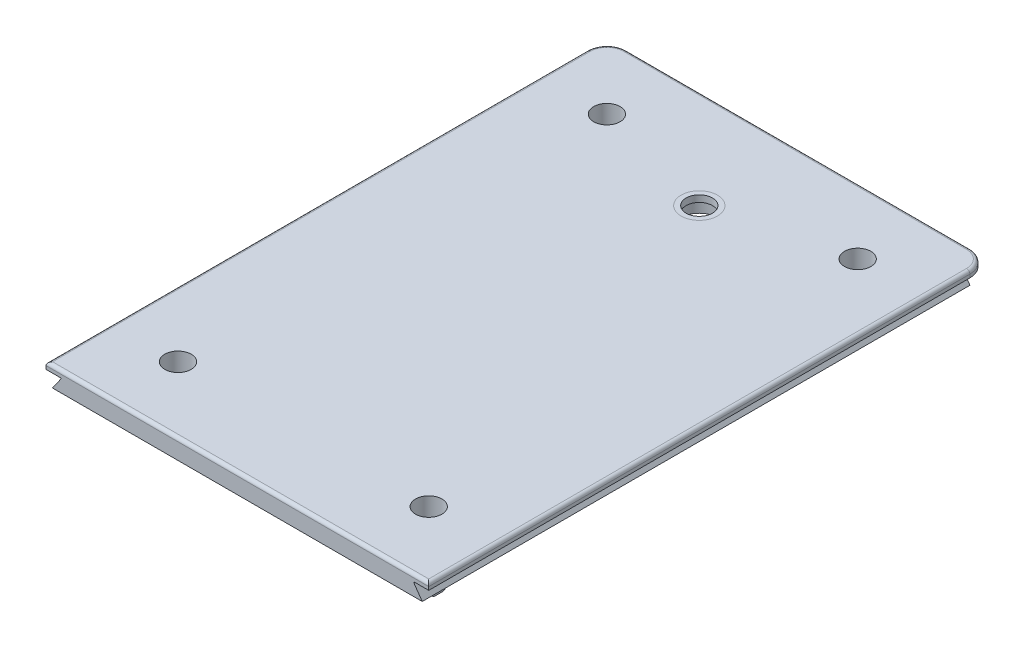
ISO-10303-21;
HEADER;
FILE_DESCRIPTION(('STEP AP214'),'2;1');
FILE_NAME('part.step','',(''),(''),'','','');
FILE_SCHEMA(('AUTOMOTIVE_DESIGN { 1 0 10303 214 1 1 1 1 }'));
ENDSEC;
DATA;
#1=APPLICATION_CONTEXT('core data for automotive mechanical design processes');
#2=APPLICATION_PROTOCOL_DEFINITION('international standard','automotive_design',2000,#1);
#3=PRODUCT_CONTEXT('',#1,'mechanical');
#4=PRODUCT('Part','Part','',(#3));
#5=PRODUCT_RELATED_PRODUCT_CATEGORY('part','',(#4));
#6=PRODUCT_DEFINITION_FORMATION('','',#4);
#7=PRODUCT_DEFINITION_CONTEXT('part definition',#1,'design');
#8=PRODUCT_DEFINITION('design','',#6,#7);
#9=PRODUCT_DEFINITION_SHAPE('','',#8);
#10=(LENGTH_UNIT() NAMED_UNIT(*) SI_UNIT(.MILLI.,.METRE.));
#11=(NAMED_UNIT(*) PLANE_ANGLE_UNIT() SI_UNIT($,.RADIAN.));
#12=(NAMED_UNIT(*) SI_UNIT($,.STERADIAN.) SOLID_ANGLE_UNIT());
#13=UNCERTAINTY_MEASURE_WITH_UNIT(LENGTH_MEASURE(1.E-05),#10,'distance_accuracy_value','');
#14=(GEOMETRIC_REPRESENTATION_CONTEXT(3) GLOBAL_UNCERTAINTY_ASSIGNED_CONTEXT((#13)) GLOBAL_UNIT_ASSIGNED_CONTEXT((#10,
#11,#12)) REPRESENTATION_CONTEXT('',''));
#15=CARTESIAN_POINT('',(0.,0.,0.));
#16=DIRECTION('',(0.,0.,1.));
#17=DIRECTION('',(1.,0.,0.));
#18=AXIS2_PLACEMENT_3D('',#15,#16,#17);
#19=CARTESIAN_POINT('',(0.,29.15,-70.));
#20=DIRECTION('',(0.,1.,0.));
#21=DIRECTION('',(0.,0.,1.));
#22=AXIS2_PLACEMENT_3D('',#19,#20,#21);
#23=CYLINDRICAL_SURFACE('',#22,2.75);
#24=CARTESIAN_POINT('',(0.,29.15,-70.));
#25=DIRECTION('',(0.,1.,0.));
#26=DIRECTION('',(0.,0.,1.));
#27=AXIS2_PLACEMENT_3D('',#24,#25,#26);
#28=CIRCLE('',#27,2.75);
#29=CARTESIAN_POINT('',(0.,29.15,-67.25));
#30=VERTEX_POINT('',#29);
#31=EDGE_CURVE('E11',#30,#30,#28,.T.);
#32=ORIENTED_EDGE('',*,*,#31,.T.);
#33=EDGE_LOOP('',(#32));
#34=FACE_BOUND('',#33,.T.);
#35=CARTESIAN_POINT('',(0.,30.15,-70.));
#36=DIRECTION('',(0.,1.,0.));
#37=DIRECTION('',(0.,0.,1.));
#38=AXIS2_PLACEMENT_3D('',#35,#36,#37);
#39=CIRCLE('',#38,2.75);
#40=CARTESIAN_POINT('',(0.,30.15,-67.25));
#41=VERTEX_POINT('',#40);
#42=EDGE_CURVE('E49',#41,#41,#39,.T.);
#43=ORIENTED_EDGE('',*,*,#42,.F.);
#44=EDGE_LOOP('',(#43));
#45=FACE_BOUND('',#44,.T.);
#46=ADVANCED_FACE('F46',(#34,#45),#23,.T.);
#47=CARTESIAN_POINT('',(0.,29.15,-70.));
#48=DIRECTION('',(0.,1.,0.));
#49=DIRECTION('',(0.,0.,1.));
#50=AXIS2_PLACEMENT_3D('',#47,#48,#49);
#51=PLANE('',#50);
#52=CARTESIAN_POINT('',(0.,29.15,-70.));
#53=DIRECTION('',(0.,1.,0.));
#54=DIRECTION('',(0.,0.,1.));
#55=AXIS2_PLACEMENT_3D('',#52,#53,#54);
#56=CIRCLE('',#55,2.);
#57=CARTESIAN_POINT('',(0.,29.15,-68.));
#58=VERTEX_POINT('',#57);
#59=EDGE_CURVE('E56',#58,#58,#56,.T.);
#60=ORIENTED_EDGE('',*,*,#59,.T.);
#61=EDGE_LOOP('',(#60));
#62=FACE_BOUND('',#61,.T.);
#63=ORIENTED_EDGE('',*,*,#31,.F.);
#64=EDGE_LOOP('',(#63));
#65=FACE_BOUND('',#64,.T.);
#66=ADVANCED_FACE('F64',(#62,#65),#51,.F.);
#67=CARTESIAN_POINT('',(0.,30.15,-70.));
#68=DIRECTION('',(0.,1.,0.));
#69=DIRECTION('',(0.,0.,1.));
#70=AXIS2_PLACEMENT_3D('',#67,#68,#69);
#71=PLANE('',#70);
#72=CARTESIAN_POINT('',(0.,30.15,-70.));
#73=DIRECTION('',(0.,1.,0.));
#74=DIRECTION('',(0.,0.,1.));
#75=AXIS2_PLACEMENT_3D('',#72,#73,#74);
#76=CIRCLE('',#75,2.);
#77=CARTESIAN_POINT('',(0.,30.15,-68.));
#78=VERTEX_POINT('',#77);
#79=EDGE_CURVE('E58',#78,#78,#76,.T.);
#80=ORIENTED_EDGE('',*,*,#79,.F.);
#81=EDGE_LOOP('',(#80));
#82=FACE_BOUND('',#81,.T.);
#83=ORIENTED_EDGE('',*,*,#42,.T.);
#84=EDGE_LOOP('',(#83));
#85=FACE_BOUND('',#84,.T.);
#86=ADVANCED_FACE('F70',(#82,#85),#71,.T.);
#87=CARTESIAN_POINT('',(0.,29.15,-70.));
#88=DIRECTION('',(0.,1.,0.));
#89=DIRECTION('',(0.,0.,1.));
#90=AXIS2_PLACEMENT_3D('',#87,#88,#89);
#91=CYLINDRICAL_SURFACE('',#90,2.);
#92=ORIENTED_EDGE('',*,*,#59,.F.);
#93=EDGE_LOOP('',(#92));
#94=FACE_BOUND('',#93,.T.);
#95=ORIENTED_EDGE('',*,*,#79,.T.);
#96=EDGE_LOOP('',(#95));
#97=FACE_BOUND('',#96,.T.);
#98=ADVANCED_FACE('F67',(#94,#97),#91,.F.);
#99=CLOSED_SHELL('',(#46,#66,#86,#98));
#100=MANIFOLD_SOLID_BREP('B2',#99);
#101=CARTESIAN_POINT('',(-28.0162186510252,27.2,-141.074973095129));
#102=DIRECTION('',(0.,-1.,0.));
#103=DIRECTION('',(1.,0.,0.));
#104=AXIS2_PLACEMENT_3D('',#101,#102,#103);
#105=PLANE('',#104);
#106=CARTESIAN_POINT('',(-19.,27.2,-10.));
#107=DIRECTION('',(0.,-1.,0.));
#108=DIRECTION('',(1.,0.,0.));
#109=AXIS2_PLACEMENT_3D('',#106,#107,#108);
#110=CIRCLE('',#109,2.);
#111=CARTESIAN_POINT('',(-17.,27.2,-10.));
#112=VERTEX_POINT('',#111);
#113=EDGE_CURVE('E424',#112,#112,#110,.F.);
#114=ORIENTED_EDGE('',*,*,#113,.T.);
#115=EDGE_LOOP('',(#114));
#116=FACE_BOUND('',#115,.T.);
#117=CARTESIAN_POINT('',(-19.,27.2,-75.));
#118=DIRECTION('',(0.,-1.,0.));
#119=DIRECTION('',(1.,0.,0.));
#120=AXIS2_PLACEMENT_3D('',#117,#118,#119);
#121=CIRCLE('',#120,2.);
#122=CARTESIAN_POINT('',(-17.,27.2,-75.));
#123=VERTEX_POINT('',#122);
#124=EDGE_CURVE('E593',#123,#123,#121,.F.);
#125=ORIENTED_EDGE('',*,*,#124,.T.);
#126=EDGE_LOOP('',(#125));
#127=FACE_BOUND('',#126,.T.);
#128=CARTESIAN_POINT('',(19.,27.2,-75.));
#129=DIRECTION('',(0.,-1.,0.));
#130=DIRECTION('',(1.,0.,0.));
#131=AXIS2_PLACEMENT_3D('',#128,#129,#130);
#132=CIRCLE('',#131,2.);
#133=CARTESIAN_POINT('',(21.,27.2,-75.));
#134=VERTEX_POINT('',#133);
#135=EDGE_CURVE('E440',#134,#134,#132,.F.);
#136=ORIENTED_EDGE('',*,*,#135,.T.);
#137=EDGE_LOOP('',(#136));
#138=FACE_BOUND('',#137,.T.);
#139=CARTESIAN_POINT('',(19.,27.2,-10.));
#140=DIRECTION('',(0.,-1.,0.));
#141=DIRECTION('',(1.,0.,0.));
#142=AXIS2_PLACEMENT_3D('',#139,#140,#141);
#143=CIRCLE('',#142,2.);
#144=CARTESIAN_POINT('',(21.,27.2,-10.));
#145=VERTEX_POINT('',#144);
#146=EDGE_CURVE('E437',#145,#145,#143,.F.);
#147=ORIENTED_EDGE('',*,*,#146,.T.);
#148=EDGE_LOOP('',(#147));
#149=FACE_BOUND('',#148,.T.);
#150=CARTESIAN_POINT('',(0.,27.2,-70.));
#151=DIRECTION('',(0.,-1.,0.));
#152=DIRECTION('',(1.,0.,0.));
#153=AXIS2_PLACEMENT_3D('',#150,#151,#152);
#154=CIRCLE('',#153,2.75);
#155=CARTESIAN_POINT('',(2.75,27.2,-70.));
#156=VERTEX_POINT('',#155);
#157=EDGE_CURVE('E436',#156,#156,#154,.F.);
#158=ORIENTED_EDGE('',*,*,#157,.T.);
#159=EDGE_LOOP('',(#158));
#160=FACE_BOUND('',#159,.T.);
#161=DIRECTION('',(1.,0.,0.));
#162=VECTOR('',#161,1.);
#163=CARTESIAN_POINT('',(28.0162186510252,27.2,-3.5));
#164=LINE('',#163,#162);
#165=CARTESIAN_POINT('',(-28.0162186510252,27.2,-3.5));
#166=VERTEX_POINT('',#165);
#167=CARTESIAN_POINT('',(28.0162186510252,27.2,-3.5));
#168=VERTEX_POINT('',#167);
#169=EDGE_CURVE('E282',#166,#168,#164,.T.);
#170=ORIENTED_EDGE('',*,*,#169,.F.);
#171=DIRECTION('',(0.,0.,1.));
#172=VECTOR('',#171,1.);
#173=CARTESIAN_POINT('',(-28.0162186510252,27.2,-141.074973095129));
#174=LINE('',#173,#172);
#175=CARTESIAN_POINT('',(-28.0162186510252,27.2,-83.));
#176=VERTEX_POINT('',#175);
#177=EDGE_CURVE('E281',#176,#166,#174,.T.);
#178=ORIENTED_EDGE('',*,*,#177,.F.);
#179=DIRECTION('',(-1.,0.,0.));
#180=VECTOR('',#179,1.);
#181=CARTESIAN_POINT('',(-28.0162186510252,27.2,-83.));
#182=LINE('',#181,#180);
#183=CARTESIAN_POINT('',(28.0162186510252,27.2,-83.));
#184=VERTEX_POINT('',#183);
#185=EDGE_CURVE('E315',#184,#176,#182,.T.);
#186=ORIENTED_EDGE('',*,*,#185,.F.);
#187=DIRECTION('',(0.,0.,1.));
#188=VECTOR('',#187,1.);
#189=CARTESIAN_POINT('',(28.0162186510252,27.2,-141.074973095129));
#190=LINE('',#189,#188);
#191=EDGE_CURVE('E355',#184,#168,#190,.T.);
#192=ORIENTED_EDGE('',*,*,#191,.T.);
#193=EDGE_LOOP('',(#170,#178,#186,#192));
#194=FACE_BOUND('',#193,.T.);
#195=ADVANCED_FACE('F124',(#116,#127,#138,#149,#160,#194),#105,.T.);
#196=CARTESIAN_POINT('',(-27.,27.,-83.));
#197=DIRECTION('',(0.,0.,1.));
#198=DIRECTION('',(-1.,0.,0.));
#199=AXIS2_PLACEMENT_3D('',#196,#197,#198);
#200=PLANE('',#199);
#201=DIRECTION('',(-1.,0.,0.));
#202=VECTOR('',#201,1.);
#203=CARTESIAN_POINT('',(29.,29.15,-83.));
#204=LINE('',#203,#202);
#205=CARTESIAN_POINT('',(26.7558450822477,29.15,-83.));
#206=VERTEX_POINT('',#205);
#207=CARTESIAN_POINT('',(-26.7558450822477,29.15,-83.));
#208=VERTEX_POINT('',#207);
#209=EDGE_CURVE('E310',#206,#208,#204,.T.);
#210=ORIENTED_EDGE('',*,*,#209,.F.);
#211=DIRECTION('',(0.,-1.,0.));
#212=VECTOR('',#211,1.);
#213=CARTESIAN_POINT('',(26.7558450822477,29.,-83.));
#214=LINE('',#213,#212);
#215=CARTESIAN_POINT('',(26.7558450822477,29.,-83.));
#216=VERTEX_POINT('',#215);
#217=EDGE_CURVE('E320',#206,#216,#214,.T.);
#218=ORIENTED_EDGE('',*,*,#217,.T.);
#219=DIRECTION('',(0.573576436351053,-0.819152044288987,0.));
#220=VECTOR('',#219,1.);
#221=CARTESIAN_POINT('',(28.0162186510252,27.2,-83.));
#222=LINE('',#221,#220);
#223=EDGE_CURVE('E317',#216,#184,#222,.T.);
#224=ORIENTED_EDGE('',*,*,#223,.T.);
#225=ORIENTED_EDGE('',*,*,#185,.T.);
#226=DIRECTION('',(0.573576436351054,0.819152044288987,0.));
#227=VECTOR('',#226,1.);
#228=CARTESIAN_POINT('',(-26.7558450822477,29.,-83.));
#229=LINE('',#228,#227);
#230=CARTESIAN_POINT('',(-26.7558450822477,29.,-83.));
#231=VERTEX_POINT('',#230);
#232=EDGE_CURVE('E314',#176,#231,#229,.T.);
#233=ORIENTED_EDGE('',*,*,#232,.T.);
#234=DIRECTION('',(0.,1.,0.));
#235=VECTOR('',#234,1.);
#236=CARTESIAN_POINT('',(-26.7558450822477,29.,-83.));
#237=LINE('',#236,#235);
#238=EDGE_CURVE('E322',#231,#208,#237,.T.);
#239=ORIENTED_EDGE('',*,*,#238,.T.);
#240=EDGE_LOOP('',(#210,#218,#224,#225,#233,#239));
#241=FACE_BOUND('',#240,.T.);
#242=ADVANCED_FACE('F463',(#241),#200,.F.);
#243=CARTESIAN_POINT('',(-26.7558450822477,29.,-141.074973095129));
#244=DIRECTION('',(-1.,0.,0.));
#245=DIRECTION('',(0.,0.,1.));
#246=AXIS2_PLACEMENT_3D('',#243,#244,#245);
#247=PLANE('',#246);
#248=ORIENTED_EDGE('',*,*,#238,.F.);
#249=DIRECTION('',(0.,0.,1.));
#250=VECTOR('',#249,1.);
#251=CARTESIAN_POINT('',(-26.7558450822477,29.,-141.074973095129));
#252=LINE('',#251,#250);
#253=CARTESIAN_POINT('',(-26.7558450822477,29.,0.));
#254=VERTEX_POINT('',#253);
#255=EDGE_CURVE('E291',#231,#254,#252,.T.);
#256=ORIENTED_EDGE('',*,*,#255,.T.);
#257=DIRECTION('',(0.,-1.,0.));
#258=VECTOR('',#257,1.);
#259=CARTESIAN_POINT('',(-26.7558450822477,29.,0.));
#260=LINE('',#259,#258);
#261=CARTESIAN_POINT('',(-26.7558450822477,29.15,0.));
#262=VERTEX_POINT('',#261);
#263=EDGE_CURVE('E309',#262,#254,#260,.T.);
#264=ORIENTED_EDGE('',*,*,#263,.F.);
#265=DIRECTION('',(0.,0.,1.));
#266=VECTOR('',#265,1.);
#267=CARTESIAN_POINT('',(-26.7558450822477,29.15,-141.074973095129));
#268=LINE('',#267,#266);
#269=EDGE_CURVE('E318',#208,#262,#268,.T.);
#270=ORIENTED_EDGE('',*,*,#269,.F.);
#271=EDGE_LOOP('',(#248,#256,#264,#270));
#272=FACE_BOUND('',#271,.T.);
#273=ADVANCED_FACE('F477',(#272),#247,.T.);
#274=CARTESIAN_POINT('',(-26.7558450822477,29.15,-141.074973095129));
#275=DIRECTION('',(0.,-1.,0.));
#276=DIRECTION('',(0.,0.,-1.));
#277=AXIS2_PLACEMENT_3D('',#274,#275,#276);
#278=PLANE('',#277);
#279=DIRECTION('',(1.,0.,0.));
#280=VECTOR('',#279,1.);
#281=CARTESIAN_POINT('',(29.,29.15,-85.));
#282=LINE('',#281,#280);
#283=CARTESIAN_POINT('',(-26.,29.15,-85.));
#284=VERTEX_POINT('',#283);
#285=CARTESIAN_POINT('',(26.,29.15,-85.));
#286=VERTEX_POINT('',#285);
#287=EDGE_CURVE('E306',#284,#286,#282,.T.);
#288=ORIENTED_EDGE('',*,*,#287,.T.);
#289=CARTESIAN_POINT('',(26.,29.15,-82.));
#290=DIRECTION('',(0.,-1.,0.));
#291=DIRECTION('',(0.,0.,-1.));
#292=AXIS2_PLACEMENT_3D('',#289,#290,#291);
#293=CIRCLE('',#292,3.);
#294=CARTESIAN_POINT('',(29.,29.15,-82.));
#295=VERTEX_POINT('',#294);
#296=EDGE_CURVE('E369',#286,#295,#293,.T.);
#297=ORIENTED_EDGE('',*,*,#296,.T.);
#298=DIRECTION('',(0.,0.,1.));
#299=VECTOR('',#298,1.);
#300=CARTESIAN_POINT('',(29.,29.15,-141.074973095129));
#301=LINE('',#300,#299);
#302=CARTESIAN_POINT('',(29.,29.15,0.));
#303=VERTEX_POINT('',#302);
#304=EDGE_CURVE('E349',#295,#303,#301,.T.);
#305=ORIENTED_EDGE('',*,*,#304,.T.);
#306=DIRECTION('',(1.,0.,0.));
#307=VECTOR('',#306,1.);
#308=CARTESIAN_POINT('',(26.7558450822477,29.15,0.));
#309=LINE('',#308,#307);
#310=CARTESIAN_POINT('',(26.7558450822477,29.15,0.));
#311=VERTEX_POINT('',#310);
#312=EDGE_CURVE('E335',#311,#303,#309,.T.);
#313=ORIENTED_EDGE('',*,*,#312,.F.);
#314=DIRECTION('',(0.,0.,1.));
#315=VECTOR('',#314,1.);
#316=CARTESIAN_POINT('',(26.7558450822477,29.15,-141.074973095129));
#317=LINE('',#316,#315);
#318=EDGE_CURVE('E351',#206,#311,#317,.T.);
#319=ORIENTED_EDGE('',*,*,#318,.F.);
#320=ORIENTED_EDGE('',*,*,#209,.T.);
#321=ORIENTED_EDGE('',*,*,#269,.T.);
#322=DIRECTION('',(1.,0.,0.));
#323=VECTOR('',#322,1.);
#324=CARTESIAN_POINT('',(-26.7558450822477,29.15,0.));
#325=LINE('',#324,#323);
#326=CARTESIAN_POINT('',(-29.,29.15,0.));
#327=VERTEX_POINT('',#326);
#328=EDGE_CURVE('E342',#327,#262,#325,.T.);
#329=ORIENTED_EDGE('',*,*,#328,.F.);
#330=DIRECTION('',(0.,0.,1.));
#331=VECTOR('',#330,1.);
#332=CARTESIAN_POINT('',(-29.,29.15,-141.074973095129));
#333=LINE('',#332,#331);
#334=CARTESIAN_POINT('',(-29.,29.15,-82.));
#335=VERTEX_POINT('',#334);
#336=EDGE_CURVE('E346',#335,#327,#333,.T.);
#337=ORIENTED_EDGE('',*,*,#336,.F.);
#338=CARTESIAN_POINT('',(-26.,29.15,-82.));
#339=DIRECTION('',(0.,-1.,0.));
#340=DIRECTION('',(0.,0.,-1.));
#341=AXIS2_PLACEMENT_3D('',#338,#339,#340);
#342=CIRCLE('',#341,3.);
#343=EDGE_CURVE('E367',#335,#284,#342,.T.);
#344=ORIENTED_EDGE('',*,*,#343,.T.);
#345=EDGE_LOOP('',(#288,#297,#305,#313,#319,#320,#321,#329,#337,#344));
#346=FACE_BOUND('',#345,.T.);
#347=ADVANCED_FACE('F480',(#346),#278,.T.);
#348=CARTESIAN_POINT('',(-29.,29.15,-141.074973095129));
#349=DIRECTION('',(-1.,0.,0.));
#350=DIRECTION('',(0.,0.,1.));
#351=AXIS2_PLACEMENT_3D('',#348,#349,#350);
#352=PLANE('',#351);
#353=DIRECTION('',(0.,-1.,0.));
#354=VECTOR('',#353,1.);
#355=CARTESIAN_POINT('',(-29.,29.15,0.));
#356=LINE('',#355,#354);
#357=CARTESIAN_POINT('',(-29.,29.65,0.));
#358=VERTEX_POINT('',#357);
#359=EDGE_CURVE('E340',#358,#327,#356,.T.);
#360=ORIENTED_EDGE('',*,*,#359,.F.);
#361=DIRECTION('',(0.,0.,1.));
#362=VECTOR('',#361,1.);
#363=CARTESIAN_POINT('',(-29.,29.65,-141.074973095129));
#364=LINE('',#363,#362);
#365=CARTESIAN_POINT('',(-29.,29.65,-82.));
#366=VERTEX_POINT('',#365);
#367=EDGE_CURVE('E394',#358,#366,#364,.F.);
#368=ORIENTED_EDGE('',*,*,#367,.T.);
#369=DIRECTION('',(0.,-1.,0.));
#370=VECTOR('',#369,1.);
#371=CARTESIAN_POINT('',(-29.,29.15,-82.));
#372=LINE('',#371,#370);
#373=EDGE_CURVE('E371',#366,#335,#372,.T.);
#374=ORIENTED_EDGE('',*,*,#373,.T.);
#375=ORIENTED_EDGE('',*,*,#336,.T.);
#376=EDGE_LOOP('',(#360,#368,#374,#375));
#377=FACE_BOUND('',#376,.T.);
#378=ADVANCED_FACE('F499',(#377),#352,.T.);
#379=CARTESIAN_POINT('',(-29.,30.15,-141.074973095129));
#380=DIRECTION('',(0.,1.,0.));
#381=DIRECTION('',(0.,0.,1.));
#382=AXIS2_PLACEMENT_3D('',#379,#380,#381);
#383=PLANE('',#382);
#384=CARTESIAN_POINT('',(-26.,30.15,-82.));
#385=DIRECTION('',(0.,1.,0.));
#386=DIRECTION('',(0.,0.,1.));
#387=AXIS2_PLACEMENT_3D('',#384,#385,#386);
#388=CIRCLE('',#387,2.5);
#389=CARTESIAN_POINT('',(-26.,30.15,-84.5));
#390=VERTEX_POINT('',#389);
#391=CARTESIAN_POINT('',(-28.5,30.15,-82.));
#392=VERTEX_POINT('',#391);
#393=EDGE_CURVE('E389',#390,#392,#388,.T.);
#394=ORIENTED_EDGE('',*,*,#393,.T.);
#395=DIRECTION('',(0.,0.,1.));
#396=VECTOR('',#395,1.);
#397=CARTESIAN_POINT('',(-28.5,30.15,-141.074973095129));
#398=LINE('',#397,#396);
#399=CARTESIAN_POINT('',(-28.5,30.15,-0.5));
#400=VERTEX_POINT('',#399);
#401=EDGE_CURVE('E391',#392,#400,#398,.T.);
#402=ORIENTED_EDGE('',*,*,#401,.T.);
#403=DIRECTION('',(-1.,0.,0.));
#404=VECTOR('',#403,1.);
#405=CARTESIAN_POINT('',(-29.,30.15,-0.5));
#406=LINE('',#405,#404);
#407=CARTESIAN_POINT('',(28.5,30.15,-0.5));
#408=VERTEX_POINT('',#407);
#409=EDGE_CURVE('E383',#400,#408,#406,.F.);
#410=ORIENTED_EDGE('',*,*,#409,.T.);
#411=DIRECTION('',(0.,0.,1.));
#412=VECTOR('',#411,1.);
#413=CARTESIAN_POINT('',(28.5,30.15,-141.074973095129));
#414=LINE('',#413,#412);
#415=CARTESIAN_POINT('',(28.5,30.15,-82.));
#416=VERTEX_POINT('',#415);
#417=EDGE_CURVE('E381',#408,#416,#414,.F.);
#418=ORIENTED_EDGE('',*,*,#417,.T.);
#419=CARTESIAN_POINT('',(26.,30.15,-82.));
#420=DIRECTION('',(0.,1.,0.));
#421=DIRECTION('',(0.,0.,1.));
#422=AXIS2_PLACEMENT_3D('',#419,#420,#421);
#423=CIRCLE('',#422,2.5);
#424=CARTESIAN_POINT('',(26.,30.15,-84.5));
#425=VERTEX_POINT('',#424);
#426=EDGE_CURVE('E385',#416,#425,#423,.T.);
#427=ORIENTED_EDGE('',*,*,#426,.T.);
#428=DIRECTION('',(-1.,0.,0.));
#429=VECTOR('',#428,1.);
#430=CARTESIAN_POINT('',(-26.,30.15,-84.5));
#431=LINE('',#430,#429);
#432=EDGE_CURVE('E387',#425,#390,#431,.T.);
#433=ORIENTED_EDGE('',*,*,#432,.T.);
#434=EDGE_LOOP('',(#394,#402,#410,#418,#427,#433));
#435=FACE_BOUND('',#434,.T.);
#436=CARTESIAN_POINT('',(-19.,30.15,-10.));
#437=DIRECTION('',(0.,1.,0.));
#438=DIRECTION('',(0.,0.,-1.));
#439=AXIS2_PLACEMENT_3D('',#436,#437,#438);
#440=CIRCLE('',#439,2.);
#441=CARTESIAN_POINT('',(-19.,30.15,-12.));
#442=VERTEX_POINT('',#441);
#443=EDGE_CURVE('E418',#442,#442,#440,.T.);
#444=ORIENTED_EDGE('',*,*,#443,.F.);
#445=EDGE_LOOP('',(#444));
#446=FACE_BOUND('',#445,.T.);
#447=CARTESIAN_POINT('',(-19.,30.15,-75.));
#448=DIRECTION('',(0.,1.,0.));
#449=DIRECTION('',(0.,0.,1.));
#450=AXIS2_PLACEMENT_3D('',#447,#448,#449);
#451=CIRCLE('',#450,2.);
#452=CARTESIAN_POINT('',(-19.,30.15,-73.));
#453=VERTEX_POINT('',#452);
#454=EDGE_CURVE('E429',#453,#453,#451,.T.);
#455=ORIENTED_EDGE('',*,*,#454,.F.);
#456=EDGE_LOOP('',(#455));
#457=FACE_BOUND('',#456,.T.);
#458=CARTESIAN_POINT('',(19.,30.15,-75.));
#459=DIRECTION('',(0.,1.,0.));
#460=DIRECTION('',(0.,0.,-1.));
#461=AXIS2_PLACEMENT_3D('',#458,#459,#460);
#462=CIRCLE('',#461,2.);
#463=CARTESIAN_POINT('',(19.,30.15,-77.));
#464=VERTEX_POINT('',#463);
#465=EDGE_CURVE('E591',#464,#464,#462,.T.);
#466=ORIENTED_EDGE('',*,*,#465,.F.);
#467=EDGE_LOOP('',(#466));
#468=FACE_BOUND('',#467,.T.);
#469=CARTESIAN_POINT('',(19.,30.15,-10.));
#470=DIRECTION('',(0.,1.,0.));
#471=DIRECTION('',(0.,0.,1.));
#472=AXIS2_PLACEMENT_3D('',#469,#470,#471);
#473=CIRCLE('',#472,2.);
#474=CARTESIAN_POINT('',(19.,30.15,-8.));
#475=VERTEX_POINT('',#474);
#476=EDGE_CURVE('E433',#475,#475,#473,.T.);
#477=ORIENTED_EDGE('',*,*,#476,.F.);
#478=EDGE_LOOP('',(#477));
#479=FACE_BOUND('',#478,.T.);
#480=CARTESIAN_POINT('',(0.,30.15,-70.));
#481=DIRECTION('',(0.,1.,0.));
#482=DIRECTION('',(0.,0.,1.));
#483=AXIS2_PLACEMENT_3D('',#480,#481,#482);
#484=CIRCLE('',#483,2.75);
#485=CARTESIAN_POINT('',(0.,30.15,-67.25));
#486=VERTEX_POINT('',#485);
#487=EDGE_CURVE('E299',#486,#486,#484,.T.);
#488=ORIENTED_EDGE('',*,*,#487,.F.);
#489=EDGE_LOOP('',(#488));
#490=FACE_BOUND('',#489,.T.);
#491=ADVANCED_FACE('F513',(#435,#446,#457,#468,#479,#490),#383,.T.);
#492=CARTESIAN_POINT('',(29.,29.15,-141.074973095129));
#493=DIRECTION('',(1.,0.,0.));
#494=DIRECTION('',(0.,0.,-1.));
#495=AXIS2_PLACEMENT_3D('',#492,#493,#494);
#496=PLANE('',#495);
#497=DIRECTION('',(0.,1.,0.));
#498=VECTOR('',#497,1.);
#499=CARTESIAN_POINT('',(29.,30.15,-82.));
#500=LINE('',#499,#498);
#501=CARTESIAN_POINT('',(29.,29.65,-82.));
#502=VERTEX_POINT('',#501);
#503=EDGE_CURVE('E313',#295,#502,#500,.T.);
#504=ORIENTED_EDGE('',*,*,#503,.T.);
#505=DIRECTION('',(0.,0.,1.));
#506=VECTOR('',#505,1.);
#507=CARTESIAN_POINT('',(29.,29.65,-141.074973095129));
#508=LINE('',#507,#506);
#509=CARTESIAN_POINT('',(29.,29.65,0.));
#510=VERTEX_POINT('',#509);
#511=EDGE_CURVE('E44',#502,#510,#508,.T.);
#512=ORIENTED_EDGE('',*,*,#511,.T.);
#513=DIRECTION('',(0.,1.,0.));
#514=VECTOR('',#513,1.);
#515=CARTESIAN_POINT('',(29.,29.15,0.));
#516=LINE('',#515,#514);
#517=EDGE_CURVE('E338',#303,#510,#516,.T.);
#518=ORIENTED_EDGE('',*,*,#517,.F.);
#519=ORIENTED_EDGE('',*,*,#304,.F.);
#520=EDGE_LOOP('',(#504,#512,#518,#519));
#521=FACE_BOUND('',#520,.T.);
#522=ADVANCED_FACE('F545',(#521),#496,.T.);
#523=CARTESIAN_POINT('',(26.7558450822477,29.,-141.074973095129));
#524=DIRECTION('',(1.,0.,0.));
#525=DIRECTION('',(0.,1.,0.));
#526=AXIS2_PLACEMENT_3D('',#523,#524,#525);
#527=PLANE('',#526);
#528=ORIENTED_EDGE('',*,*,#217,.F.);
#529=ORIENTED_EDGE('',*,*,#318,.T.);
#530=DIRECTION('',(0.,1.,0.));
#531=VECTOR('',#530,1.);
#532=CARTESIAN_POINT('',(26.7558450822477,29.,0.));
#533=LINE('',#532,#531);
#534=CARTESIAN_POINT('',(26.7558450822477,29.,0.));
#535=VERTEX_POINT('',#534);
#536=EDGE_CURVE('E332',#535,#311,#533,.T.);
#537=ORIENTED_EDGE('',*,*,#536,.F.);
#538=DIRECTION('',(0.,0.,1.));
#539=VECTOR('',#538,1.);
#540=CARTESIAN_POINT('',(26.7558450822477,29.,-141.074973095129));
#541=LINE('',#540,#539);
#542=EDGE_CURVE('E353',#216,#535,#541,.T.);
#543=ORIENTED_EDGE('',*,*,#542,.F.);
#544=EDGE_LOOP('',(#528,#529,#537,#543));
#545=FACE_BOUND('',#544,.T.);
#546=ADVANCED_FACE('F469',(#545),#527,.T.);
#547=CARTESIAN_POINT('',(28.0162186510252,27.2,-141.074973095129));
#548=DIRECTION('',(0.819152044288987,0.573576436351053,0.));
#549=DIRECTION('',(-0.573576436351053,0.819152044288987,0.));
#550=AXIS2_PLACEMENT_3D('',#547,#548,#549);
#551=PLANE('',#550);
#552=ORIENTED_EDGE('',*,*,#223,.F.);
#553=ORIENTED_EDGE('',*,*,#542,.T.);
#554=DIRECTION('',(-0.573576436351053,0.819152044288987,0.));
#555=VECTOR('',#554,1.);
#556=CARTESIAN_POINT('',(28.0162186510252,27.2,0.));
#557=LINE('',#556,#555);
#558=CARTESIAN_POINT('',(28.0162186510252,27.2,0.));
#559=VERTEX_POINT('',#558);
#560=EDGE_CURVE('E329',#559,#535,#557,.T.);
#561=ORIENTED_EDGE('',*,*,#560,.F.);
#562=CARTESIAN_POINT('',(28.0162186510252,27.2,-1.5));
#563=VERTEX_POINT('',#562);
#564=EDGE_CURVE('E357',#563,#559,#190,.T.);
#565=ORIENTED_EDGE('',*,*,#564,.F.);
#566=DIRECTION('',(0.,0.,1.));
#567=VECTOR('',#566,1.);
#568=CARTESIAN_POINT('',(28.0162186510252,27.2,-1.5));
#569=LINE('',#568,#567);
#570=EDGE_CURVE('E296',#168,#563,#569,.T.);
#571=ORIENTED_EDGE('',*,*,#570,.F.);
#572=ORIENTED_EDGE('',*,*,#191,.F.);
#573=EDGE_LOOP('',(#552,#553,#561,#565,#571,#572));
#574=FACE_BOUND('',#573,.T.);
#575=ADVANCED_FACE('F458',(#574),#551,.T.);
#576=DIRECTION('',(-1.,0.,0.));
#577=VECTOR('',#576,1.);
#578=CARTESIAN_POINT('',(28.0162186510252,27.2,-1.5));
#579=LINE('',#578,#577);
#580=CARTESIAN_POINT('',(-28.0162186510252,27.2,-1.50000000000001));
#581=VERTEX_POINT('',#580);
#582=EDGE_CURVE('E283',#563,#581,#579,.T.);
#583=ORIENTED_EDGE('',*,*,#582,.F.);
#584=ORIENTED_EDGE('',*,*,#564,.T.);
#585=DIRECTION('',(1.,0.,0.));
#586=VECTOR('',#585,1.);
#587=CARTESIAN_POINT('',(-28.0162186510252,27.2,0.));
#588=LINE('',#587,#586);
#589=CARTESIAN_POINT('',(-28.0162186510252,27.2,0.));
#590=VERTEX_POINT('',#589);
#591=EDGE_CURVE('E289',#590,#559,#588,.T.);
#592=ORIENTED_EDGE('',*,*,#591,.F.);
#593=EDGE_CURVE('E278',#581,#590,#174,.T.);
#594=ORIENTED_EDGE('',*,*,#593,.F.);
#595=EDGE_LOOP('',(#583,#584,#592,#594));
#596=FACE_BOUND('',#595,.T.);
#597=ADVANCED_FACE('F286',(#596),#105,.T.);
#598=CARTESIAN_POINT('',(-26.7558450822477,29.,-141.074973095129));
#599=DIRECTION('',(-0.819152044288987,0.573576436351054,0.));
#600=DIRECTION('',(-0.573576436351054,-0.819152044288987,0.));
#601=AXIS2_PLACEMENT_3D('',#598,#599,#600);
#602=PLANE('',#601);
#603=ORIENTED_EDGE('',*,*,#232,.F.);
#604=ORIENTED_EDGE('',*,*,#177,.T.);
#605=DIRECTION('',(0.,0.,-1.));
#606=VECTOR('',#605,1.);
#607=CARTESIAN_POINT('',(-28.0162186510252,27.2,-1.50000000000001));
#608=LINE('',#607,#606);
#609=EDGE_CURVE('E261',#581,#166,#608,.T.);
#610=ORIENTED_EDGE('',*,*,#609,.F.);
#611=ORIENTED_EDGE('',*,*,#593,.T.);
#612=DIRECTION('',(-0.573576436351054,-0.819152044288986,0.));
#613=VECTOR('',#612,1.);
#614=CARTESIAN_POINT('',(-26.7558450822477,29.,0.));
#615=LINE('',#614,#613);
#616=EDGE_CURVE('E326',#254,#590,#615,.T.);
#617=ORIENTED_EDGE('',*,*,#616,.F.);
#618=ORIENTED_EDGE('',*,*,#255,.F.);
#619=EDGE_LOOP('',(#603,#604,#610,#611,#617,#618));
#620=FACE_BOUND('',#619,.T.);
#621=ADVANCED_FACE('F276',(#620),#602,.T.);
#622=CARTESIAN_POINT('',(0.,0.,0.));
#623=DIRECTION('',(0.,0.,1.));
#624=DIRECTION('',(1.,0.,0.));
#625=AXIS2_PLACEMENT_3D('',#622,#623,#624);
#626=PLANE('',#625);
#627=ORIENTED_EDGE('',*,*,#517,.T.);
#628=DIRECTION('',(-1.,0.,0.));
#629=VECTOR('',#628,1.);
#630=CARTESIAN_POINT('',(0.,29.65,0.));
#631=LINE('',#630,#629);
#632=EDGE_CURVE('E133',#510,#358,#631,.T.);
#633=ORIENTED_EDGE('',*,*,#632,.T.);
#634=ORIENTED_EDGE('',*,*,#359,.T.);
#635=ORIENTED_EDGE('',*,*,#328,.T.);
#636=ORIENTED_EDGE('',*,*,#263,.T.);
#637=ORIENTED_EDGE('',*,*,#616,.T.);
#638=ORIENTED_EDGE('',*,*,#591,.T.);
#639=ORIENTED_EDGE('',*,*,#560,.T.);
#640=ORIENTED_EDGE('',*,*,#536,.T.);
#641=ORIENTED_EDGE('',*,*,#312,.T.);
#642=EDGE_LOOP('',(#627,#633,#634,#635,#636,#637,#638,#639,#640,#641));
#643=FACE_BOUND('',#642,.T.);
#644=ADVANCED_FACE('F473',(#643),#626,.T.);
#645=CARTESIAN_POINT('',(29.,2.,-85.));
#646=DIRECTION('',(0.,0.,1.));
#647=DIRECTION('',(-1.,0.,0.));
#648=AXIS2_PLACEMENT_3D('',#645,#646,#647);
#649=PLANE('',#648);
#650=DIRECTION('',(0.,-1.,0.));
#651=VECTOR('',#650,1.);
#652=CARTESIAN_POINT('',(-26.,30.15,-85.));
#653=LINE('',#652,#651);
#654=CARTESIAN_POINT('',(-26.,29.65,-85.));
#655=VERTEX_POINT('',#654);
#656=EDGE_CURVE('E362',#284,#655,#653,.F.);
#657=ORIENTED_EDGE('',*,*,#656,.T.);
#658=DIRECTION('',(-1.,0.,0.));
#659=VECTOR('',#658,1.);
#660=CARTESIAN_POINT('',(26.,29.65,-85.));
#661=LINE('',#660,#659);
#662=CARTESIAN_POINT('',(26.,29.65,-85.));
#663=VERTEX_POINT('',#662);
#664=EDGE_CURVE('E399',#655,#663,#661,.F.);
#665=ORIENTED_EDGE('',*,*,#664,.T.);
#666=DIRECTION('',(0.,1.,0.));
#667=VECTOR('',#666,1.);
#668=CARTESIAN_POINT('',(26.,29.15,-85.));
#669=LINE('',#668,#667);
#670=EDGE_CURVE('E365',#663,#286,#669,.F.);
#671=ORIENTED_EDGE('',*,*,#670,.T.);
#672=ORIENTED_EDGE('',*,*,#287,.F.);
#673=EDGE_LOOP('',(#657,#665,#671,#672));
#674=FACE_BOUND('',#673,.T.);
#675=ADVANCED_FACE('F508',(#674),#649,.F.);
#676=CARTESIAN_POINT('',(26.,29.15,-82.));
#677=DIRECTION('',(0.,-1.,0.));
#678=DIRECTION('',(0.,0.,-1.));
#679=AXIS2_PLACEMENT_3D('',#676,#677,#678);
#680=CYLINDRICAL_SURFACE('',#679,3.);
#681=ORIENTED_EDGE('',*,*,#670,.F.);
#682=CARTESIAN_POINT('',(26.,29.65,-82.));
#683=DIRECTION('',(0.,1.,0.));
#684=DIRECTION('',(0.,0.,1.));
#685=AXIS2_PLACEMENT_3D('',#682,#683,#684);
#686=CIRCLE('',#685,3.);
#687=EDGE_CURVE('E147',#663,#502,#686,.F.);
#688=ORIENTED_EDGE('',*,*,#687,.T.);
#689=ORIENTED_EDGE('',*,*,#503,.F.);
#690=ORIENTED_EDGE('',*,*,#296,.F.);
#691=EDGE_LOOP('',(#681,#688,#689,#690));
#692=FACE_BOUND('',#691,.T.);
#693=ADVANCED_FACE('F509',(#692),#680,.T.);
#694=CARTESIAN_POINT('',(-26.,29.15,-82.));
#695=DIRECTION('',(0.,1.,0.));
#696=DIRECTION('',(0.,0.,1.));
#697=AXIS2_PLACEMENT_3D('',#694,#695,#696);
#698=CYLINDRICAL_SURFACE('',#697,3.);
#699=ORIENTED_EDGE('',*,*,#373,.F.);
#700=CARTESIAN_POINT('',(-26.,29.65,-82.));
#701=DIRECTION('',(0.,1.,0.));
#702=DIRECTION('',(0.,0.,1.));
#703=AXIS2_PLACEMENT_3D('',#700,#701,#702);
#704=CIRCLE('',#703,3.);
#705=EDGE_CURVE('E397',#366,#655,#704,.F.);
#706=ORIENTED_EDGE('',*,*,#705,.T.);
#707=ORIENTED_EDGE('',*,*,#656,.F.);
#708=ORIENTED_EDGE('',*,*,#343,.F.);
#709=EDGE_LOOP('',(#699,#706,#707,#708));
#710=FACE_BOUND('',#709,.T.);
#711=ADVANCED_FACE('F502',(#710),#698,.T.);
#712=CARTESIAN_POINT('',(28.0162186510252,26.95,-1.5));
#713=DIRECTION('',(-1.,0.,0.));
#714=DIRECTION('',(0.,0.,1.));
#715=AXIS2_PLACEMENT_3D('',#712,#713,#714);
#716=PLANE('',#715);
#717=DIRECTION('',(0.,0.,1.));
#718=VECTOR('',#717,1.);
#719=CARTESIAN_POINT('',(28.0162186510252,26.95,-1.5));
#720=LINE('',#719,#718);
#721=CARTESIAN_POINT('',(28.0162186510252,26.95,-3.06698729810778));
#722=VERTEX_POINT('',#721);
#723=CARTESIAN_POINT('',(28.0162186510252,26.95,-1.93301270189222));
#724=VERTEX_POINT('',#723);
#725=EDGE_CURVE('E305',#722,#724,#720,.T.);
#726=ORIENTED_EDGE('',*,*,#725,.F.);
#727=CARTESIAN_POINT('',(28.0162186510252,27.45,-3.06698729810778));
#728=DIRECTION('',(-1.,0.,0.));
#729=DIRECTION('',(0.,0.,1.));
#730=AXIS2_PLACEMENT_3D('',#727,#728,#729);
#731=CIRCLE('',#730,0.5);
#732=EDGE_CURVE('E270',#722,#168,#731,.F.);
#733=ORIENTED_EDGE('',*,*,#732,.T.);
#734=ORIENTED_EDGE('',*,*,#570,.T.);
#735=CARTESIAN_POINT('',(28.0162186510252,27.45,-1.93301270189222));
#736=DIRECTION('',(-1.,0.,0.));
#737=DIRECTION('',(0.,0.,1.));
#738=AXIS2_PLACEMENT_3D('',#735,#736,#737);
#739=CIRCLE('',#738,0.5);
#740=EDGE_CURVE('E295',#563,#724,#739,.F.);
#741=ORIENTED_EDGE('',*,*,#740,.T.);
#742=EDGE_LOOP('',(#726,#733,#734,#741));
#743=FACE_BOUND('',#742,.T.);
#744=ADVANCED_FACE('F454',(#743),#716,.F.);
#745=CARTESIAN_POINT('',(-28.0162186510252,26.95,-1.50000000000001));
#746=DIRECTION('',(1.,0.,0.));
#747=DIRECTION('',(0.,0.,-1.));
#748=AXIS2_PLACEMENT_3D('',#745,#746,#747);
#749=PLANE('',#748);
#750=ORIENTED_EDGE('',*,*,#609,.T.);
#751=CARTESIAN_POINT('',(-28.0162186510252,27.45,-3.06698729810779));
#752=DIRECTION('',(1.,0.,0.));
#753=DIRECTION('',(0.,0.,-1.));
#754=AXIS2_PLACEMENT_3D('',#751,#752,#753);
#755=CIRCLE('',#754,0.5);
#756=CARTESIAN_POINT('',(-28.0162186510252,26.95,-3.06698729810779));
#757=VERTEX_POINT('',#756);
#758=EDGE_CURVE('E269',#166,#757,#755,.F.);
#759=ORIENTED_EDGE('',*,*,#758,.T.);
#760=DIRECTION('',(0.,0.,-1.));
#761=VECTOR('',#760,1.);
#762=CARTESIAN_POINT('',(-28.0162186510252,26.95,-1.50000000000001));
#763=LINE('',#762,#761);
#764=CARTESIAN_POINT('',(-28.0162186510252,26.95,-1.93301270189223));
#765=VERTEX_POINT('',#764);
#766=EDGE_CURVE('E264',#765,#757,#763,.T.);
#767=ORIENTED_EDGE('',*,*,#766,.F.);
#768=CARTESIAN_POINT('',(-28.0162186510252,27.45,-1.93301270189223));
#769=DIRECTION('',(1.,0.,0.));
#770=DIRECTION('',(0.,0.,-1.));
#771=AXIS2_PLACEMENT_3D('',#768,#769,#770);
#772=CIRCLE('',#771,0.5);
#773=EDGE_CURVE('E258',#765,#581,#772,.F.);
#774=ORIENTED_EDGE('',*,*,#773,.T.);
#775=EDGE_LOOP('',(#750,#759,#767,#774));
#776=FACE_BOUND('',#775,.T.);
#777=ADVANCED_FACE('F260',(#776),#749,.F.);
#778=CARTESIAN_POINT('',(0.,26.95,0.));
#779=DIRECTION('',(0.,1.,0.));
#780=DIRECTION('',(0.,0.,1.));
#781=AXIS2_PLACEMENT_3D('',#778,#779,#780);
#782=PLANE('',#781);
#783=ORIENTED_EDGE('',*,*,#766,.T.);
#784=DIRECTION('',(1.,0.,0.));
#785=VECTOR('',#784,1.);
#786=CARTESIAN_POINT('',(0.,26.95,-3.06698729810778));
#787=LINE('',#786,#785);
#788=EDGE_CURVE('E375',#757,#722,#787,.T.);
#789=ORIENTED_EDGE('',*,*,#788,.T.);
#790=ORIENTED_EDGE('',*,*,#725,.T.);
#791=DIRECTION('',(-1.,0.,0.));
#792=VECTOR('',#791,1.);
#793=CARTESIAN_POINT('',(0.,26.95,-1.93301270189223));
#794=LINE('',#793,#792);
#795=EDGE_CURVE('E373',#724,#765,#794,.T.);
#796=ORIENTED_EDGE('',*,*,#795,.T.);
#797=EDGE_LOOP('',(#783,#789,#790,#796));
#798=FACE_BOUND('',#797,.T.);
#799=ADVANCED_FACE('F448',(#798),#782,.F.);
#800=CARTESIAN_POINT('',(28.0162186510252,27.45,-3.06698729810778));
#801=DIRECTION('',(1.,0.,0.));
#802=DIRECTION('',(0.,1.,0.));
#803=AXIS2_PLACEMENT_3D('',#800,#801,#802);
#804=CYLINDRICAL_SURFACE('',#803,0.5);
#805=ORIENTED_EDGE('',*,*,#758,.F.);
#806=ORIENTED_EDGE('',*,*,#169,.T.);
#807=ORIENTED_EDGE('',*,*,#732,.F.);
#808=ORIENTED_EDGE('',*,*,#788,.F.);
#809=EDGE_LOOP('',(#805,#806,#807,#808));
#810=FACE_BOUND('',#809,.T.);
#811=ADVANCED_FACE('F451',(#810),#804,.T.);
#812=CARTESIAN_POINT('',(28.0162186510252,27.45,-1.93301270189222));
#813=DIRECTION('',(-1.,0.,0.));
#814=DIRECTION('',(0.,-1.,0.));
#815=AXIS2_PLACEMENT_3D('',#812,#813,#814);
#816=CYLINDRICAL_SURFACE('',#815,0.5);
#817=ORIENTED_EDGE('',*,*,#740,.F.);
#818=ORIENTED_EDGE('',*,*,#582,.T.);
#819=ORIENTED_EDGE('',*,*,#773,.F.);
#820=ORIENTED_EDGE('',*,*,#795,.F.);
#821=EDGE_LOOP('',(#817,#818,#819,#820));
#822=FACE_BOUND('',#821,.T.);
#823=ADVANCED_FACE('F294',(#822),#816,.T.);
#824=CARTESIAN_POINT('',(0.,26.949,-70.));
#825=DIRECTION('',(0.,1.,0.));
#826=DIRECTION('',(0.,0.,1.));
#827=AXIS2_PLACEMENT_3D('',#824,#825,#826);
#828=CYLINDRICAL_SURFACE('',#827,2.75);
#829=ORIENTED_EDGE('',*,*,#157,.F.);
#830=EDGE_LOOP('',(#829));
#831=FACE_BOUND('',#830,.T.);
#832=ORIENTED_EDGE('',*,*,#487,.T.);
#833=EDGE_LOOP('',(#832));
#834=FACE_BOUND('',#833,.T.);
#835=ADVANCED_FACE('F566',(#831,#834),#828,.F.);
#836=CARTESIAN_POINT('',(19.,26.949,-10.));
#837=DIRECTION('',(0.,1.,0.));
#838=DIRECTION('',(0.,0.,1.));
#839=AXIS2_PLACEMENT_3D('',#836,#837,#838);
#840=CYLINDRICAL_SURFACE('',#839,2.);
#841=ORIENTED_EDGE('',*,*,#146,.F.);
#842=EDGE_LOOP('',(#841));
#843=FACE_BOUND('',#842,.T.);
#844=ORIENTED_EDGE('',*,*,#476,.T.);
#845=EDGE_LOOP('',(#844));
#846=FACE_BOUND('',#845,.T.);
#847=ADVANCED_FACE('F569',(#843,#846),#840,.F.);
#848=CARTESIAN_POINT('',(19.,26.949,-75.));
#849=DIRECTION('',(0.,1.,0.));
#850=DIRECTION('',(0.,0.,1.));
#851=AXIS2_PLACEMENT_3D('',#848,#849,#850);
#852=CYLINDRICAL_SURFACE('',#851,2.);
#853=ORIENTED_EDGE('',*,*,#135,.F.);
#854=EDGE_LOOP('',(#853));
#855=FACE_BOUND('',#854,.T.);
#856=ORIENTED_EDGE('',*,*,#465,.T.);
#857=EDGE_LOOP('',(#856));
#858=FACE_BOUND('',#857,.T.);
#859=ADVANCED_FACE('F573',(#855,#858),#852,.F.);
#860=CARTESIAN_POINT('',(-19.,26.949,-75.));
#861=DIRECTION('',(0.,1.,0.));
#862=DIRECTION('',(0.,0.,1.));
#863=AXIS2_PLACEMENT_3D('',#860,#861,#862);
#864=CYLINDRICAL_SURFACE('',#863,2.);
#865=ORIENTED_EDGE('',*,*,#124,.F.);
#866=EDGE_LOOP('',(#865));
#867=FACE_BOUND('',#866,.T.);
#868=ORIENTED_EDGE('',*,*,#454,.T.);
#869=EDGE_LOOP('',(#868));
#870=FACE_BOUND('',#869,.T.);
#871=ADVANCED_FACE('F577',(#867,#870),#864,.F.);
#872=CARTESIAN_POINT('',(-19.,26.949,-10.));
#873=DIRECTION('',(0.,1.,0.));
#874=DIRECTION('',(0.,0.,1.));
#875=AXIS2_PLACEMENT_3D('',#872,#873,#874);
#876=CYLINDRICAL_SURFACE('',#875,2.);
#877=ORIENTED_EDGE('',*,*,#113,.F.);
#878=EDGE_LOOP('',(#877));
#879=FACE_BOUND('',#878,.T.);
#880=ORIENTED_EDGE('',*,*,#443,.T.);
#881=EDGE_LOOP('',(#880));
#882=FACE_BOUND('',#881,.T.);
#883=ADVANCED_FACE('F526',(#879,#882),#876,.F.);
#884=CARTESIAN_POINT('',(26.,29.65,-82.));
#885=DIRECTION('',(0.,1.,0.));
#886=DIRECTION('',(0.,0.,1.));
#887=AXIS2_PLACEMENT_3D('',#884,#885,#886);
#888=TOROIDAL_SURFACE('',#887,2.5,0.5);
#889=CARTESIAN_POINT('',(28.5,29.65,-82.));
#890=DIRECTION('',(0.,0.,1.));
#891=DIRECTION('',(1.,0.,0.));
#892=AXIS2_PLACEMENT_3D('',#889,#890,#891);
#893=CIRCLE('',#892,0.5);
#894=EDGE_CURVE('E412',#502,#416,#893,.T.);
#895=ORIENTED_EDGE('',*,*,#894,.F.);
#896=ORIENTED_EDGE('',*,*,#687,.F.);
#897=CARTESIAN_POINT('',(26.,29.65,-84.5));
#898=DIRECTION('',(-1.,0.,0.));
#899=DIRECTION('',(0.,0.,1.));
#900=AXIS2_PLACEMENT_3D('',#897,#898,#899);
#901=CIRCLE('',#900,0.5);
#902=EDGE_CURVE('E128',#425,#663,#901,.T.);
#903=ORIENTED_EDGE('',*,*,#902,.F.);
#904=ORIENTED_EDGE('',*,*,#426,.F.);
#905=EDGE_LOOP('',(#895,#896,#903,#904));
#906=FACE_BOUND('',#905,.T.);
#907=ADVANCED_FACE('F126',(#906),#888,.T.);
#908=CARTESIAN_POINT('',(-29.,29.65,-84.5));
#909=DIRECTION('',(1.,0.,0.));
#910=DIRECTION('',(0.,0.,-1.));
#911=AXIS2_PLACEMENT_3D('',#908,#909,#910);
#912=CYLINDRICAL_SURFACE('',#911,0.5);
#913=ORIENTED_EDGE('',*,*,#902,.T.);
#914=ORIENTED_EDGE('',*,*,#664,.F.);
#915=CARTESIAN_POINT('',(-26.,29.65,-84.5));
#916=DIRECTION('',(-1.,0.,0.));
#917=DIRECTION('',(0.,0.,1.));
#918=AXIS2_PLACEMENT_3D('',#915,#916,#917);
#919=CIRCLE('',#918,0.5);
#920=EDGE_CURVE('E410',#390,#655,#919,.T.);
#921=ORIENTED_EDGE('',*,*,#920,.F.);
#922=ORIENTED_EDGE('',*,*,#432,.F.);
#923=EDGE_LOOP('',(#913,#914,#921,#922));
#924=FACE_BOUND('',#923,.T.);
#925=ADVANCED_FACE('F519',(#924),#912,.T.);
#926=CARTESIAN_POINT('',(28.5,29.65,-141.074973095129));
#927=DIRECTION('',(0.,0.,1.));
#928=DIRECTION('',(1.,0.,0.));
#929=AXIS2_PLACEMENT_3D('',#926,#927,#928);
#930=CYLINDRICAL_SURFACE('',#929,0.5);
#931=ORIENTED_EDGE('',*,*,#894,.T.);
#932=ORIENTED_EDGE('',*,*,#417,.F.);
#933=CARTESIAN_POINT('',(28.5,29.65,-0.5));
#934=DIRECTION('',(-0.707106781186547,0.,0.707106781186547));
#935=DIRECTION('',(0.707106781186547,0.,0.707106781186547));
#936=AXIS2_PLACEMENT_3D('',#933,#934,#935);
#937=ELLIPSE('',#936,0.707106781186547,0.5);
#938=EDGE_CURVE('E407',#510,#408,#937,.T.);
#939=ORIENTED_EDGE('',*,*,#938,.F.);
#940=ORIENTED_EDGE('',*,*,#511,.F.);
#941=EDGE_LOOP('',(#931,#932,#939,#940));
#942=FACE_BOUND('',#941,.T.);
#943=ADVANCED_FACE('F486',(#942),#930,.T.);
#944=CARTESIAN_POINT('',(-26.,29.65,-82.));
#945=DIRECTION('',(0.,1.,0.));
#946=DIRECTION('',(0.,0.,1.));
#947=AXIS2_PLACEMENT_3D('',#944,#945,#946);
#948=TOROIDAL_SURFACE('',#947,2.5,0.5);
#949=ORIENTED_EDGE('',*,*,#920,.T.);
#950=ORIENTED_EDGE('',*,*,#705,.F.);
#951=CARTESIAN_POINT('',(-28.5,29.65,-82.));
#952=DIRECTION('',(0.,0.,1.));
#953=DIRECTION('',(1.,0.,0.));
#954=AXIS2_PLACEMENT_3D('',#951,#952,#953);
#955=CIRCLE('',#954,0.5);
#956=EDGE_CURVE('E405',#392,#366,#955,.T.);
#957=ORIENTED_EDGE('',*,*,#956,.F.);
#958=ORIENTED_EDGE('',*,*,#393,.F.);
#959=EDGE_LOOP('',(#949,#950,#957,#958));
#960=FACE_BOUND('',#959,.T.);
#961=ADVANCED_FACE('F518',(#960),#948,.T.);
#962=CARTESIAN_POINT('',(0.,29.65,-0.5));
#963=DIRECTION('',(-1.,0.,0.));
#964=DIRECTION('',(0.,0.,1.));
#965=AXIS2_PLACEMENT_3D('',#962,#963,#964);
#966=CYLINDRICAL_SURFACE('',#965,0.5);
#967=ORIENTED_EDGE('',*,*,#938,.T.);
#968=ORIENTED_EDGE('',*,*,#409,.F.);
#969=CARTESIAN_POINT('',(-28.5,29.65,-0.5));
#970=DIRECTION('',(-0.707106781186547,0.,-0.707106781186547));
#971=DIRECTION('',(-0.707106781186547,0.,0.707106781186547));
#972=AXIS2_PLACEMENT_3D('',#969,#970,#971);
#973=ELLIPSE('',#972,0.707106781186547,0.5);
#974=EDGE_CURVE('E403',#358,#400,#973,.T.);
#975=ORIENTED_EDGE('',*,*,#974,.F.);
#976=ORIENTED_EDGE('',*,*,#632,.F.);
#977=EDGE_LOOP('',(#967,#968,#975,#976));
#978=FACE_BOUND('',#977,.T.);
#979=ADVANCED_FACE('F490',(#978),#966,.T.);
#980=CARTESIAN_POINT('',(-28.5,29.65,-141.074973095129));
#981=DIRECTION('',(0.,0.,1.));
#982=DIRECTION('',(1.,0.,0.));
#983=AXIS2_PLACEMENT_3D('',#980,#981,#982);
#984=CYLINDRICAL_SURFACE('',#983,0.5);
#985=ORIENTED_EDGE('',*,*,#956,.T.);
#986=ORIENTED_EDGE('',*,*,#367,.F.);
#987=ORIENTED_EDGE('',*,*,#974,.T.);
#988=ORIENTED_EDGE('',*,*,#401,.F.);
#989=EDGE_LOOP('',(#985,#986,#987,#988));
#990=FACE_BOUND('',#989,.T.);
#991=ADVANCED_FACE('F494',(#990),#984,.T.);
#992=CLOSED_SHELL('',(#195,#242,#273,#347,#378,#491,#522,#546,#575,#597,#621,#644,#675,#693,
#711,#744,#777,#799,#811,#823,#835,#847,#859,#871,#883,#907,#925,#943,#961,#979,#991));
#993=MANIFOLD_SOLID_BREP('B6',#992);
#994=ADVANCED_BREP_SHAPE_REPRESENTATION('',(#18,#100,#993),#14);
#995=SHAPE_DEFINITION_REPRESENTATION(#9,#994);
ENDSEC;
END-ISO-10303-21;
